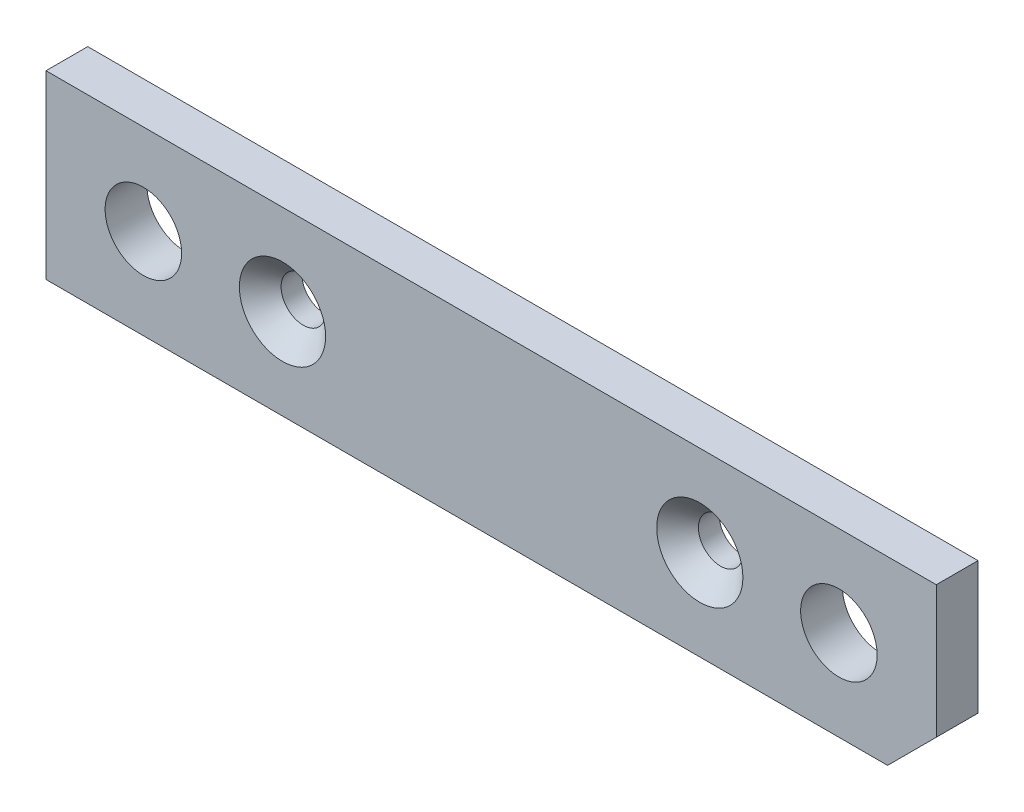
ISO-10303-21;
HEADER;
FILE_DESCRIPTION(('STEP AP214'),'2;1');
FILE_NAME('part.step','',(''),(''),'','','');
FILE_SCHEMA(('AUTOMOTIVE_DESIGN { 1 0 10303 214 1 1 1 1 }'));
ENDSEC;
DATA;
#1=APPLICATION_CONTEXT('core data for automotive mechanical design processes');
#2=APPLICATION_PROTOCOL_DEFINITION('international standard','automotive_design',2000,#1);
#3=PRODUCT_CONTEXT('',#1,'mechanical');
#4=PRODUCT('Part','Part','',(#3));
#5=PRODUCT_RELATED_PRODUCT_CATEGORY('part','',(#4));
#6=PRODUCT_DEFINITION_FORMATION('','',#4);
#7=PRODUCT_DEFINITION_CONTEXT('part definition',#1,'design');
#8=PRODUCT_DEFINITION('design','',#6,#7);
#9=PRODUCT_DEFINITION_SHAPE('','',#8);
#10=(LENGTH_UNIT() NAMED_UNIT(*) SI_UNIT(.MILLI.,.METRE.));
#11=(NAMED_UNIT(*) PLANE_ANGLE_UNIT() SI_UNIT($,.RADIAN.));
#12=(NAMED_UNIT(*) SI_UNIT($,.STERADIAN.) SOLID_ANGLE_UNIT());
#13=UNCERTAINTY_MEASURE_WITH_UNIT(LENGTH_MEASURE(1.E-05),#10,'distance_accuracy_value','');
#14=(GEOMETRIC_REPRESENTATION_CONTEXT(3) GLOBAL_UNCERTAINTY_ASSIGNED_CONTEXT((#13)) GLOBAL_UNIT_ASSIGNED_CONTEXT((#10,
#11,#12)) REPRESENTATION_CONTEXT('',''));
#15=CARTESIAN_POINT('',(0.,0.,0.));
#16=DIRECTION('',(0.,0.,1.));
#17=DIRECTION('',(1.,0.,0.));
#18=AXIS2_PLACEMENT_3D('',#15,#16,#17);
#19=CARTESIAN_POINT('',(0.,0.,1.5));
#20=DIRECTION('',(0.,0.,1.));
#21=DIRECTION('',(1.,0.,0.));
#22=AXIS2_PLACEMENT_3D('',#19,#20,#21);
#23=PLANE('',#22);
#24=CARTESIAN_POINT('',(15.,0.,1.5));
#25=DIRECTION('',(0.,0.,1.));
#26=DIRECTION('',(1.,0.,0.));
#27=AXIS2_PLACEMENT_3D('',#24,#25,#26);
#28=CIRCLE('',#27,3.1);
#29=CARTESIAN_POINT('',(18.1,0.,1.5));
#30=VERTEX_POINT('',#29);
#31=EDGE_CURVE('E46',#30,#30,#28,.F.);
#32=ORIENTED_EDGE('',*,*,#31,.T.);
#33=EDGE_LOOP('',(#32));
#34=FACE_BOUND('',#33,.T.);
#35=CARTESIAN_POINT('',(-15.,0.,1.5));
#36=DIRECTION('',(0.,0.,1.));
#37=DIRECTION('',(1.,0.,0.));
#38=AXIS2_PLACEMENT_3D('',#35,#36,#37);
#39=CIRCLE('',#38,3.1);
#40=CARTESIAN_POINT('',(-11.9,0.,1.5));
#41=VERTEX_POINT('',#40);
#42=EDGE_CURVE('E123',#41,#41,#39,.F.);
#43=ORIENTED_EDGE('',*,*,#42,.T.);
#44=EDGE_LOOP('',(#43));
#45=FACE_BOUND('',#44,.T.);
#46=CARTESIAN_POINT('',(-25.,0.,1.5));
#47=DIRECTION('',(0.,0.,1.));
#48=DIRECTION('',(1.,0.,0.));
#49=AXIS2_PLACEMENT_3D('',#46,#47,#48);
#50=CIRCLE('',#49,2.75);
#51=CARTESIAN_POINT('',(-22.25,0.,1.5));
#52=VERTEX_POINT('',#51);
#53=EDGE_CURVE('E157',#52,#52,#50,.T.);
#54=ORIENTED_EDGE('',*,*,#53,.F.);
#55=EDGE_LOOP('',(#54));
#56=FACE_BOUND('',#55,.T.);
#57=DIRECTION('',(1.,0.,0.));
#58=VECTOR('',#57,1.);
#59=CARTESIAN_POINT('',(32.,-6.5,1.5));
#60=LINE('',#59,#58);
#61=CARTESIAN_POINT('',(-32.,-6.50000000000001,1.5));
#62=VERTEX_POINT('',#61);
#63=CARTESIAN_POINT('',(28.5,-6.5,1.5));
#64=VERTEX_POINT('',#63);
#65=EDGE_CURVE('E83',#62,#64,#60,.T.);
#66=ORIENTED_EDGE('',*,*,#65,.T.);
#67=DIRECTION('',(-0.707106781186548,-0.707106781186547,0.));
#68=VECTOR('',#67,1.);
#69=CARTESIAN_POINT('',(17.5,-17.5,1.5));
#70=LINE('',#69,#68);
#71=CARTESIAN_POINT('',(32.,-3.00000000000001,1.5));
#72=VERTEX_POINT('',#71);
#73=EDGE_CURVE('E118',#64,#72,#70,.F.);
#74=ORIENTED_EDGE('',*,*,#73,.T.);
#75=DIRECTION('',(0.,1.,0.));
#76=VECTOR('',#75,1.);
#77=CARTESIAN_POINT('',(32.,-6.5,1.5));
#78=LINE('',#77,#76);
#79=CARTESIAN_POINT('',(32.,6.50000000000001,1.5));
#80=VERTEX_POINT('',#79);
#81=EDGE_CURVE('E91',#72,#80,#78,.T.);
#82=ORIENTED_EDGE('',*,*,#81,.T.);
#83=DIRECTION('',(-1.,0.,0.));
#84=VECTOR('',#83,1.);
#85=CARTESIAN_POINT('',(32.,6.50000000000001,1.5));
#86=LINE('',#85,#84);
#87=CARTESIAN_POINT('',(-32.,6.49999999999999,1.5));
#88=VERTEX_POINT('',#87);
#89=EDGE_CURVE('E97',#80,#88,#86,.T.);
#90=ORIENTED_EDGE('',*,*,#89,.T.);
#91=DIRECTION('',(0.,-1.,0.));
#92=VECTOR('',#91,1.);
#93=CARTESIAN_POINT('',(-32.,-6.50000000000001,1.5));
#94=LINE('',#93,#92);
#95=EDGE_CURVE('E92',#88,#62,#94,.T.);
#96=ORIENTED_EDGE('',*,*,#95,.T.);
#97=EDGE_LOOP('',(#66,#74,#82,#90,#96));
#98=FACE_BOUND('',#97,.T.);
#99=CARTESIAN_POINT('',(25.,0.,1.5));
#100=DIRECTION('',(0.,0.,1.));
#101=DIRECTION('',(1.,0.,0.));
#102=AXIS2_PLACEMENT_3D('',#99,#100,#101);
#103=CIRCLE('',#102,2.75);
#104=CARTESIAN_POINT('',(27.75,0.,1.5));
#105=VERTEX_POINT('',#104);
#106=EDGE_CURVE('E151',#105,#105,#103,.T.);
#107=ORIENTED_EDGE('',*,*,#106,.F.);
#108=EDGE_LOOP('',(#107));
#109=FACE_BOUND('',#108,.T.);
#110=ADVANCED_FACE('F37',(#34,#45,#56,#98,#109),#23,.T.);
#111=CARTESIAN_POINT('',(0.,0.,-1.5));
#112=DIRECTION('',(0.,0.,1.));
#113=DIRECTION('',(1.,0.,0.));
#114=AXIS2_PLACEMENT_3D('',#111,#112,#113);
#115=PLANE('',#114);
#116=DIRECTION('',(0.,1.,0.));
#117=VECTOR('',#116,1.);
#118=CARTESIAN_POINT('',(32.,-6.5,-1.5));
#119=LINE('',#118,#117);
#120=CARTESIAN_POINT('',(32.,-3.00000000000001,-1.5));
#121=VERTEX_POINT('',#120);
#122=CARTESIAN_POINT('',(32.,6.50000000000001,-1.5));
#123=VERTEX_POINT('',#122);
#124=EDGE_CURVE('E167',#121,#123,#119,.T.);
#125=ORIENTED_EDGE('',*,*,#124,.F.);
#126=DIRECTION('',(0.707106781186548,0.707106781186547,0.));
#127=VECTOR('',#126,1.);
#128=CARTESIAN_POINT('',(32.,-3.00000000000001,-1.5));
#129=LINE('',#128,#127);
#130=CARTESIAN_POINT('',(28.5,-6.5,-1.5));
#131=VERTEX_POINT('',#130);
#132=EDGE_CURVE('E61',#121,#131,#129,.F.);
#133=ORIENTED_EDGE('',*,*,#132,.T.);
#134=DIRECTION('',(1.,0.,0.));
#135=VECTOR('',#134,1.);
#136=CARTESIAN_POINT('',(32.,-6.5,-1.5));
#137=LINE('',#136,#135);
#138=CARTESIAN_POINT('',(-32.,-6.50000000000001,-1.5));
#139=VERTEX_POINT('',#138);
#140=EDGE_CURVE('E165',#139,#131,#137,.T.);
#141=ORIENTED_EDGE('',*,*,#140,.F.);
#142=DIRECTION('',(0.,-1.,0.));
#143=VECTOR('',#142,1.);
#144=CARTESIAN_POINT('',(-32.,-6.50000000000001,-1.5));
#145=LINE('',#144,#143);
#146=CARTESIAN_POINT('',(-32.,6.49999999999999,-1.5));
#147=VERTEX_POINT('',#146);
#148=EDGE_CURVE('E105',#147,#139,#145,.T.);
#149=ORIENTED_EDGE('',*,*,#148,.F.);
#150=DIRECTION('',(-1.,0.,0.));
#151=VECTOR('',#150,1.);
#152=CARTESIAN_POINT('',(32.,6.50000000000001,-1.5));
#153=LINE('',#152,#151);
#154=EDGE_CURVE('E101',#123,#147,#153,.T.);
#155=ORIENTED_EDGE('',*,*,#154,.F.);
#156=EDGE_LOOP('',(#125,#133,#141,#149,#155));
#157=FACE_BOUND('',#156,.T.);
#158=CARTESIAN_POINT('',(-25.,0.,-1.5));
#159=DIRECTION('',(0.,0.,1.));
#160=DIRECTION('',(1.,0.,0.));
#161=AXIS2_PLACEMENT_3D('',#158,#159,#160);
#162=CIRCLE('',#161,2.75);
#163=CARTESIAN_POINT('',(-22.25,0.,-1.5));
#164=VERTEX_POINT('',#163);
#165=EDGE_CURVE('E154',#164,#164,#162,.T.);
#166=ORIENTED_EDGE('',*,*,#165,.T.);
#167=EDGE_LOOP('',(#166));
#168=FACE_BOUND('',#167,.T.);
#169=CARTESIAN_POINT('',(25.,0.,-1.5));
#170=DIRECTION('',(0.,0.,1.));
#171=DIRECTION('',(1.,0.,0.));
#172=AXIS2_PLACEMENT_3D('',#169,#170,#171);
#173=CIRCLE('',#172,2.75);
#174=CARTESIAN_POINT('',(27.75,0.,-1.5));
#175=VERTEX_POINT('',#174);
#176=EDGE_CURVE('E148',#175,#175,#173,.T.);
#177=ORIENTED_EDGE('',*,*,#176,.T.);
#178=EDGE_LOOP('',(#177));
#179=FACE_BOUND('',#178,.T.);
#180=CARTESIAN_POINT('',(-15.,0.,-1.5));
#181=DIRECTION('',(0.,0.,1.));
#182=DIRECTION('',(1.,0.,0.));
#183=AXIS2_PLACEMENT_3D('',#180,#181,#182);
#184=CIRCLE('',#183,1.6);
#185=CARTESIAN_POINT('',(-13.4,0.,-1.5));
#186=VERTEX_POINT('',#185);
#187=EDGE_CURVE('E145',#186,#186,#184,.T.);
#188=ORIENTED_EDGE('',*,*,#187,.T.);
#189=EDGE_LOOP('',(#188));
#190=FACE_BOUND('',#189,.T.);
#191=CARTESIAN_POINT('',(15.,0.,-1.5));
#192=DIRECTION('',(0.,0.,1.));
#193=DIRECTION('',(-1.,0.,0.));
#194=AXIS2_PLACEMENT_3D('',#191,#192,#193);
#195=CIRCLE('',#194,1.6);
#196=CARTESIAN_POINT('',(13.4,0.,-1.5));
#197=VERTEX_POINT('',#196);
#198=EDGE_CURVE('E143',#197,#197,#195,.T.);
#199=ORIENTED_EDGE('',*,*,#198,.T.);
#200=EDGE_LOOP('',(#199));
#201=FACE_BOUND('',#200,.T.);
#202=ADVANCED_FACE('F171',(#157,#168,#179,#190,#201),#115,.F.);
#203=CARTESIAN_POINT('',(-32.,-6.50000000000001,1.5));
#204=DIRECTION('',(1.,0.,0.));
#205=DIRECTION('',(0.,0.,-1.));
#206=AXIS2_PLACEMENT_3D('',#203,#204,#205);
#207=PLANE('',#206);
#208=ORIENTED_EDGE('',*,*,#148,.T.);
#209=DIRECTION('',(0.,0.,-1.));
#210=VECTOR('',#209,1.);
#211=CARTESIAN_POINT('',(-32.,-6.50000000000001,1.5));
#212=LINE('',#211,#210);
#213=EDGE_CURVE('E87',#62,#139,#212,.T.);
#214=ORIENTED_EDGE('',*,*,#213,.F.);
#215=ORIENTED_EDGE('',*,*,#95,.F.);
#216=DIRECTION('',(0.,0.,-1.));
#217=VECTOR('',#216,1.);
#218=CARTESIAN_POINT('',(-32.,6.49999999999999,1.5));
#219=LINE('',#218,#217);
#220=EDGE_CURVE('E112',#88,#147,#219,.T.);
#221=ORIENTED_EDGE('',*,*,#220,.T.);
#222=EDGE_LOOP('',(#208,#214,#215,#221));
#223=FACE_BOUND('',#222,.T.);
#224=ADVANCED_FACE('F103',(#223),#207,.F.);
#225=CARTESIAN_POINT('',(32.,-6.5,1.5));
#226=DIRECTION('',(0.,1.,0.));
#227=DIRECTION('',(-1.,0.,0.));
#228=AXIS2_PLACEMENT_3D('',#225,#226,#227);
#229=PLANE('',#228);
#230=ORIENTED_EDGE('',*,*,#140,.T.);
#231=DIRECTION('',(0.,0.,1.));
#232=VECTOR('',#231,1.);
#233=CARTESIAN_POINT('',(28.5,-6.5,1.5));
#234=LINE('',#233,#232);
#235=EDGE_CURVE('E53',#131,#64,#234,.T.);
#236=ORIENTED_EDGE('',*,*,#235,.T.);
#237=ORIENTED_EDGE('',*,*,#65,.F.);
#238=ORIENTED_EDGE('',*,*,#213,.T.);
#239=EDGE_LOOP('',(#230,#236,#237,#238));
#240=FACE_BOUND('',#239,.T.);
#241=ADVANCED_FACE('F85',(#240),#229,.F.);
#242=CARTESIAN_POINT('',(32.,-6.5,1.5));
#243=DIRECTION('',(-1.,0.,0.));
#244=DIRECTION('',(0.,0.,1.));
#245=AXIS2_PLACEMENT_3D('',#242,#243,#244);
#246=PLANE('',#245);
#247=ORIENTED_EDGE('',*,*,#81,.F.);
#248=DIRECTION('',(0.,0.,-1.));
#249=VECTOR('',#248,1.);
#250=CARTESIAN_POINT('',(32.,-3.00000000000001,1.5));
#251=LINE('',#250,#249);
#252=EDGE_CURVE('E106',#72,#121,#251,.T.);
#253=ORIENTED_EDGE('',*,*,#252,.T.);
#254=ORIENTED_EDGE('',*,*,#124,.T.);
#255=DIRECTION('',(0.,0.,-1.));
#256=VECTOR('',#255,1.);
#257=CARTESIAN_POINT('',(32.,6.50000000000001,1.5));
#258=LINE('',#257,#256);
#259=EDGE_CURVE('E107',#80,#123,#258,.T.);
#260=ORIENTED_EDGE('',*,*,#259,.F.);
#261=EDGE_LOOP('',(#247,#253,#254,#260));
#262=FACE_BOUND('',#261,.T.);
#263=ADVANCED_FACE('F178',(#262),#246,.F.);
#264=CARTESIAN_POINT('',(32.,6.50000000000001,1.5));
#265=DIRECTION('',(0.,-1.,0.));
#266=DIRECTION('',(1.,0.,0.));
#267=AXIS2_PLACEMENT_3D('',#264,#265,#266);
#268=PLANE('',#267);
#269=ORIENTED_EDGE('',*,*,#154,.T.);
#270=ORIENTED_EDGE('',*,*,#220,.F.);
#271=ORIENTED_EDGE('',*,*,#89,.F.);
#272=ORIENTED_EDGE('',*,*,#259,.T.);
#273=EDGE_LOOP('',(#269,#270,#271,#272));
#274=FACE_BOUND('',#273,.T.);
#275=ADVANCED_FACE('F179',(#274),#268,.F.);
#276=CARTESIAN_POINT('',(-25.,0.,1.5));
#277=DIRECTION('',(0.,0.,-1.));
#278=DIRECTION('',(-1.,0.,0.));
#279=AXIS2_PLACEMENT_3D('',#276,#277,#278);
#280=CYLINDRICAL_SURFACE('',#279,2.75);
#281=ORIENTED_EDGE('',*,*,#53,.T.);
#282=EDGE_LOOP('',(#281));
#283=FACE_BOUND('',#282,.T.);
#284=ORIENTED_EDGE('',*,*,#165,.F.);
#285=EDGE_LOOP('',(#284));
#286=FACE_BOUND('',#285,.T.);
#287=ADVANCED_FACE('F181',(#283,#286),#280,.F.);
#288=CARTESIAN_POINT('',(25.,0.,1.5));
#289=DIRECTION('',(0.,0.,-1.));
#290=DIRECTION('',(-1.,0.,0.));
#291=AXIS2_PLACEMENT_3D('',#288,#289,#290);
#292=CYLINDRICAL_SURFACE('',#291,2.75);
#293=ORIENTED_EDGE('',*,*,#106,.T.);
#294=EDGE_LOOP('',(#293));
#295=FACE_BOUND('',#294,.T.);
#296=ORIENTED_EDGE('',*,*,#176,.F.);
#297=EDGE_LOOP('',(#296));
#298=FACE_BOUND('',#297,.T.);
#299=ADVANCED_FACE('F187',(#295,#298),#292,.F.);
#300=CARTESIAN_POINT('',(-15.,0.,1.5));
#301=DIRECTION('',(0.,0.,-1.));
#302=DIRECTION('',(-1.,0.,0.));
#303=AXIS2_PLACEMENT_3D('',#300,#301,#302);
#304=CYLINDRICAL_SURFACE('',#303,1.6);
#305=CARTESIAN_POINT('',(-15.,0.,0.));
#306=DIRECTION('',(0.,0.,1.));
#307=DIRECTION('',(1.,0.,0.));
#308=AXIS2_PLACEMENT_3D('',#305,#306,#307);
#309=CIRCLE('',#308,1.6);
#310=CARTESIAN_POINT('',(-13.4,0.,0.));
#311=VERTEX_POINT('',#310);
#312=EDGE_CURVE('E11',#311,#311,#309,.T.);
#313=ORIENTED_EDGE('',*,*,#312,.T.);
#314=EDGE_LOOP('',(#313));
#315=FACE_BOUND('',#314,.T.);
#316=ORIENTED_EDGE('',*,*,#187,.F.);
#317=EDGE_LOOP('',(#316));
#318=FACE_BOUND('',#317,.T.);
#319=ADVANCED_FACE('F139',(#315,#318),#304,.F.);
#320=CARTESIAN_POINT('',(15.,0.,1.5));
#321=DIRECTION('',(0.,0.,-1.));
#322=DIRECTION('',(-1.,0.,0.));
#323=AXIS2_PLACEMENT_3D('',#320,#321,#322);
#324=CYLINDRICAL_SURFACE('',#323,1.6);
#325=CARTESIAN_POINT('',(15.,0.,0.));
#326=DIRECTION('',(0.,0.,1.));
#327=DIRECTION('',(1.,0.,0.));
#328=AXIS2_PLACEMENT_3D('',#325,#326,#327);
#329=CIRCLE('',#328,1.6);
#330=CARTESIAN_POINT('',(16.6,0.,0.));
#331=VERTEX_POINT('',#330);
#332=EDGE_CURVE('E120',#331,#331,#329,.T.);
#333=ORIENTED_EDGE('',*,*,#332,.T.);
#334=EDGE_LOOP('',(#333));
#335=FACE_BOUND('',#334,.T.);
#336=ORIENTED_EDGE('',*,*,#198,.F.);
#337=EDGE_LOOP('',(#336));
#338=FACE_BOUND('',#337,.T.);
#339=ADVANCED_FACE('F136',(#335,#338),#324,.F.);
#340=CARTESIAN_POINT('',(32.,-3.00000000000001,1.5));
#341=DIRECTION('',(-0.707106781186547,0.707106781186548,0.));
#342=DIRECTION('',(0.,0.,-1.));
#343=AXIS2_PLACEMENT_3D('',#340,#341,#342);
#344=PLANE('',#343);
#345=ORIENTED_EDGE('',*,*,#73,.F.);
#346=ORIENTED_EDGE('',*,*,#235,.F.);
#347=ORIENTED_EDGE('',*,*,#132,.F.);
#348=ORIENTED_EDGE('',*,*,#252,.F.);
#349=EDGE_LOOP('',(#345,#346,#347,#348));
#350=FACE_BOUND('',#349,.T.);
#351=ADVANCED_FACE('F133',(#350),#344,.F.);
#352=CARTESIAN_POINT('',(15.,0.,0.));
#353=DIRECTION('',(0.,0.,1.));
#354=DIRECTION('',(1.,0.,0.));
#355=AXIS2_PLACEMENT_3D('',#352,#353,#354);
#356=CONICAL_SURFACE('',#355,1.6,0.785398163397449);
#357=ORIENTED_EDGE('',*,*,#31,.F.);
#358=EDGE_LOOP('',(#357));
#359=FACE_BOUND('',#358,.T.);
#360=ORIENTED_EDGE('',*,*,#332,.F.);
#361=EDGE_LOOP('',(#360));
#362=FACE_BOUND('',#361,.T.);
#363=ADVANCED_FACE('F130',(#359,#362),#356,.F.);
#364=CARTESIAN_POINT('',(-15.,0.,0.));
#365=DIRECTION('',(0.,0.,1.));
#366=DIRECTION('',(1.,0.,0.));
#367=AXIS2_PLACEMENT_3D('',#364,#365,#366);
#368=CONICAL_SURFACE('',#367,1.6,0.785398163397449);
#369=ORIENTED_EDGE('',*,*,#42,.F.);
#370=EDGE_LOOP('',(#369));
#371=FACE_BOUND('',#370,.T.);
#372=ORIENTED_EDGE('',*,*,#312,.F.);
#373=EDGE_LOOP('',(#372));
#374=FACE_BOUND('',#373,.T.);
#375=ADVANCED_FACE('F40',(#371,#374),#368,.F.);
#376=CLOSED_SHELL('',(#110,#202,#224,#241,#263,#275,#287,#299,#319,#339,#351,#363,#375));
#377=MANIFOLD_SOLID_BREP('B2',#376);
#378=ADVANCED_BREP_SHAPE_REPRESENTATION('',(#18,#377),#14);
#379=SHAPE_DEFINITION_REPRESENTATION(#9,#378);
ENDSEC;
END-ISO-10303-21;
